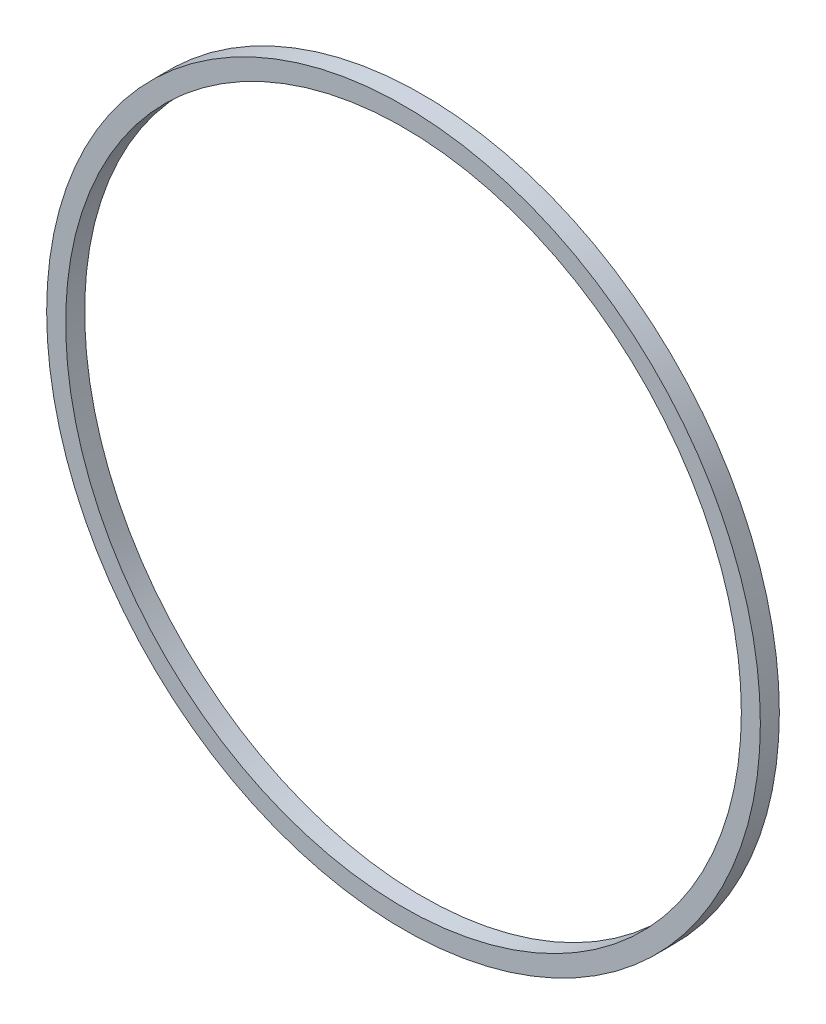
ISO-10303-21;
HEADER;
FILE_DESCRIPTION(('STEP AP214'),'2;1');
FILE_NAME('part.step','',(''),(''),'','','');
FILE_SCHEMA(('AUTOMOTIVE_DESIGN { 1 0 10303 214 1 1 1 1 }'));
ENDSEC;
DATA;
#1=APPLICATION_CONTEXT('core data for automotive mechanical design processes');
#2=APPLICATION_PROTOCOL_DEFINITION('international standard','automotive_design',2000,#1);
#3=PRODUCT_CONTEXT('',#1,'mechanical');
#4=PRODUCT('Part','Part','',(#3));
#5=PRODUCT_RELATED_PRODUCT_CATEGORY('part','',(#4));
#6=PRODUCT_DEFINITION_FORMATION('','',#4);
#7=PRODUCT_DEFINITION_CONTEXT('part definition',#1,'design');
#8=PRODUCT_DEFINITION('design','',#6,#7);
#9=PRODUCT_DEFINITION_SHAPE('','',#8);
#10=(LENGTH_UNIT() NAMED_UNIT(*) SI_UNIT(.MILLI.,.METRE.));
#11=(NAMED_UNIT(*) PLANE_ANGLE_UNIT() SI_UNIT($,.RADIAN.));
#12=(NAMED_UNIT(*) SI_UNIT($,.STERADIAN.) SOLID_ANGLE_UNIT());
#13=UNCERTAINTY_MEASURE_WITH_UNIT(LENGTH_MEASURE(1.E-05),#10,'distance_accuracy_value','');
#14=(GEOMETRIC_REPRESENTATION_CONTEXT(3) GLOBAL_UNCERTAINTY_ASSIGNED_CONTEXT((#13)) GLOBAL_UNIT_ASSIGNED_CONTEXT((#10,
#11,#12)) REPRESENTATION_CONTEXT('',''));
#15=CARTESIAN_POINT('',(0.,0.,0.));
#16=DIRECTION('',(0.,0.,1.));
#17=DIRECTION('',(1.,0.,0.));
#18=AXIS2_PLACEMENT_3D('',#15,#16,#17);
#19=CARTESIAN_POINT('',(0.,0.,2.25));
#20=DIRECTION('',(0.,0.,1.));
#21=DIRECTION('',(1.,0.,0.));
#22=AXIS2_PLACEMENT_3D('',#19,#20,#21);
#23=PLANE('',#22);
#24=CARTESIAN_POINT('',(0.,0.,2.25));
#25=DIRECTION('',(0.,0.,1.));
#26=DIRECTION('',(1.,0.,0.));
#27=AXIS2_PLACEMENT_3D('',#24,#25,#26);
#28=CIRCLE('',#27,42.25);
#29=CARTESIAN_POINT('',(42.25,0.,2.25));
#30=VERTEX_POINT('',#29);
#31=EDGE_CURVE('E10',#30,#30,#28,.T.);
#32=ORIENTED_EDGE('',*,*,#31,.T.);
#33=EDGE_LOOP('',(#32));
#34=FACE_BOUND('',#33,.T.);
#35=CARTESIAN_POINT('',(0.,0.,2.25));
#36=DIRECTION('',(0.,0.,1.));
#37=DIRECTION('',(1.,0.,0.));
#38=AXIS2_PLACEMENT_3D('',#35,#36,#37);
#39=CIRCLE('',#38,40.);
#40=CARTESIAN_POINT('',(40.,0.,2.25));
#41=VERTEX_POINT('',#40);
#42=EDGE_CURVE('E41',#41,#41,#39,.T.);
#43=ORIENTED_EDGE('',*,*,#42,.F.);
#44=EDGE_LOOP('',(#43));
#45=FACE_BOUND('',#44,.T.);
#46=ADVANCED_FACE('F30',(#34,#45),#23,.T.);
#47=CARTESIAN_POINT('',(0.,0.,0.));
#48=DIRECTION('',(0.,0.,1.));
#49=DIRECTION('',(1.,0.,0.));
#50=AXIS2_PLACEMENT_3D('',#47,#48,#49);
#51=PLANE('',#50);
#52=CARTESIAN_POINT('',(0.,0.,0.));
#53=DIRECTION('',(0.,0.,1.));
#54=DIRECTION('',(1.,0.,0.));
#55=AXIS2_PLACEMENT_3D('',#52,#53,#54);
#56=CIRCLE('',#55,42.25);
#57=CARTESIAN_POINT('',(42.25,0.,0.));
#58=VERTEX_POINT('',#57);
#59=EDGE_CURVE('E34',#58,#58,#56,.T.);
#60=ORIENTED_EDGE('',*,*,#59,.F.);
#61=EDGE_LOOP('',(#60));
#62=FACE_BOUND('',#61,.T.);
#63=CARTESIAN_POINT('',(0.,0.,0.));
#64=DIRECTION('',(0.,0.,1.));
#65=DIRECTION('',(1.,0.,0.));
#66=AXIS2_PLACEMENT_3D('',#63,#64,#65);
#67=CIRCLE('',#66,40.);
#68=CARTESIAN_POINT('',(40.,0.,0.));
#69=VERTEX_POINT('',#68);
#70=EDGE_CURVE('E43',#69,#69,#67,.T.);
#71=ORIENTED_EDGE('',*,*,#70,.T.);
#72=EDGE_LOOP('',(#71));
#73=FACE_BOUND('',#72,.T.);
#74=ADVANCED_FACE('F53',(#62,#73),#51,.F.);
#75=CARTESIAN_POINT('',(0.,0.,2.25));
#76=DIRECTION('',(0.,0.,-1.));
#77=DIRECTION('',(-1.,0.,0.));
#78=AXIS2_PLACEMENT_3D('',#75,#76,#77);
#79=CYLINDRICAL_SURFACE('',#78,42.25);
#80=ORIENTED_EDGE('',*,*,#31,.F.);
#81=EDGE_LOOP('',(#80));
#82=FACE_BOUND('',#81,.T.);
#83=ORIENTED_EDGE('',*,*,#59,.T.);
#84=EDGE_LOOP('',(#83));
#85=FACE_BOUND('',#84,.T.);
#86=ADVANCED_FACE('F32',(#82,#85),#79,.T.);
#87=CARTESIAN_POINT('',(0.,0.,2.25));
#88=DIRECTION('',(0.,0.,-1.));
#89=DIRECTION('',(-1.,0.,0.));
#90=AXIS2_PLACEMENT_3D('',#87,#88,#89);
#91=CYLINDRICAL_SURFACE('',#90,40.);
#92=ORIENTED_EDGE('',*,*,#42,.T.);
#93=EDGE_LOOP('',(#92));
#94=FACE_BOUND('',#93,.T.);
#95=ORIENTED_EDGE('',*,*,#70,.F.);
#96=EDGE_LOOP('',(#95));
#97=FACE_BOUND('',#96,.T.);
#98=ADVANCED_FACE('F49',(#94,#97),#91,.F.);
#99=CLOSED_SHELL('',(#46,#74,#86,#98));
#100=MANIFOLD_SOLID_BREP('B2',#99);
#101=ADVANCED_BREP_SHAPE_REPRESENTATION('',(#18,#100),#14);
#102=SHAPE_DEFINITION_REPRESENTATION(#9,#101);
ENDSEC;
END-ISO-10303-21;
